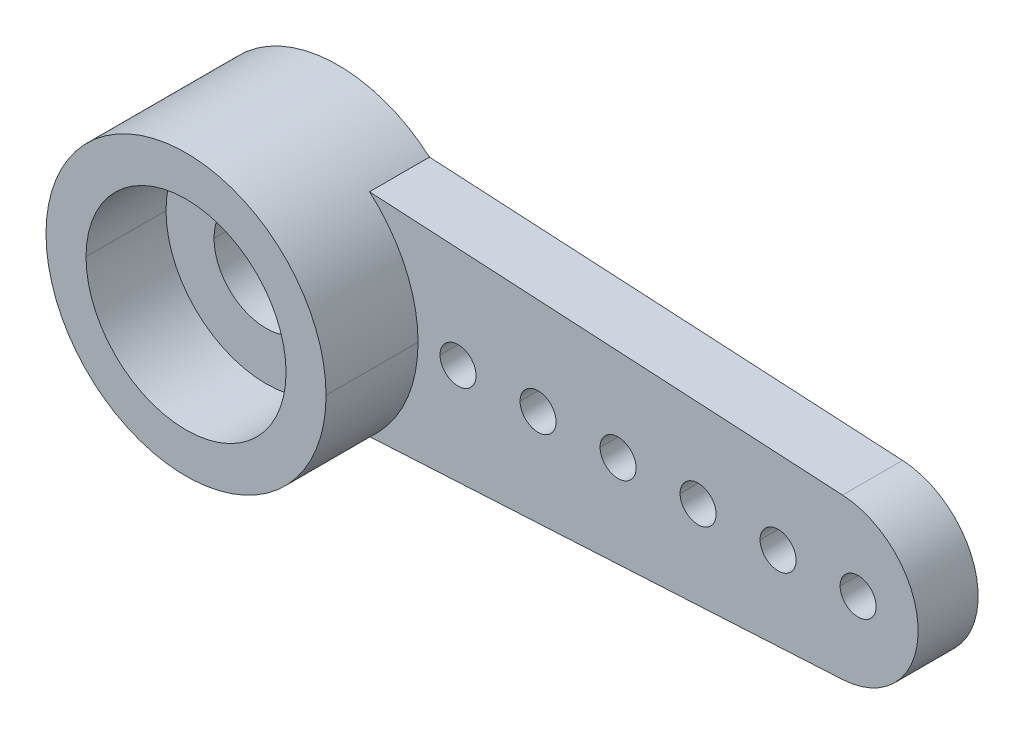
ISO-10303-21;
HEADER;
FILE_DESCRIPTION(('STEP AP214'),'2;1');
FILE_NAME('part.step','',(''),(''),'','','');
FILE_SCHEMA(('AUTOMOTIVE_DESIGN { 1 0 10303 214 1 1 1 1 }'));
ENDSEC;
DATA;
#1=APPLICATION_CONTEXT('core data for automotive mechanical design processes');
#2=APPLICATION_PROTOCOL_DEFINITION('international standard','automotive_design',2000,#1);
#3=PRODUCT_CONTEXT('',#1,'mechanical');
#4=PRODUCT('Part','Part','',(#3));
#5=PRODUCT_RELATED_PRODUCT_CATEGORY('part','',(#4));
#6=PRODUCT_DEFINITION_FORMATION('','',#4);
#7=PRODUCT_DEFINITION_CONTEXT('part definition',#1,'design');
#8=PRODUCT_DEFINITION('design','',#6,#7);
#9=PRODUCT_DEFINITION_SHAPE('','',#8);
#10=(LENGTH_UNIT() NAMED_UNIT(*) SI_UNIT(.MILLI.,.METRE.));
#11=(NAMED_UNIT(*) PLANE_ANGLE_UNIT() SI_UNIT($,.RADIAN.));
#12=(NAMED_UNIT(*) SI_UNIT($,.STERADIAN.) SOLID_ANGLE_UNIT());
#13=UNCERTAINTY_MEASURE_WITH_UNIT(LENGTH_MEASURE(1.E-05),#10,'distance_accuracy_value','');
#14=(GEOMETRIC_REPRESENTATION_CONTEXT(3) GLOBAL_UNCERTAINTY_ASSIGNED_CONTEXT((#13)) GLOBAL_UNIT_ASSIGNED_CONTEXT((#10,
#11,#12)) REPRESENTATION_CONTEXT('',''));
#15=CARTESIAN_POINT('',(0.,0.,0.));
#16=DIRECTION('',(0.,0.,1.));
#17=DIRECTION('',(1.,0.,0.));
#18=AXIS2_PLACEMENT_3D('',#15,#16,#17);
#19=CARTESIAN_POINT('',(8.5,0.,3.801));
#20=DIRECTION('',(0.,0.,-1.));
#21=DIRECTION('',(-1.,0.,0.));
#22=AXIS2_PLACEMENT_3D('',#19,#20,#21);
#23=CYLINDRICAL_SURFACE('',#22,0.45);
#24=DIRECTION('',(0.,0.,-1.));
#25=VECTOR('',#24,1.);
#26=CARTESIAN_POINT('',(8.95,0.,3.801));
#27=LINE('',#26,#25);
#28=CARTESIAN_POINT('',(8.95,0.,1.5));
#29=VERTEX_POINT('',#28);
#30=CARTESIAN_POINT('',(8.95,0.,0.));
#31=VERTEX_POINT('',#30);
#32=EDGE_CURVE('E381',#29,#31,#27,.T.);
#33=ORIENTED_EDGE('',*,*,#32,.F.);
#34=CARTESIAN_POINT('',(8.5,0.,1.5));
#35=DIRECTION('',(0.,0.,-1.));
#36=DIRECTION('',(1.,0.,0.));
#37=AXIS2_PLACEMENT_3D('',#34,#35,#36);
#38=CIRCLE('',#37,0.45);
#39=CARTESIAN_POINT('',(8.05,0.,1.5));
#40=VERTEX_POINT('',#39);
#41=EDGE_CURVE('E255',#40,#29,#38,.T.);
#42=ORIENTED_EDGE('',*,*,#41,.F.);
#43=DIRECTION('',(0.,0.,-1.));
#44=VECTOR('',#43,1.);
#45=CARTESIAN_POINT('',(8.05,0.,3.801));
#46=LINE('',#45,#44);
#47=CARTESIAN_POINT('',(8.05,0.,0.));
#48=VERTEX_POINT('',#47);
#49=EDGE_CURVE('E273',#40,#48,#46,.T.);
#50=ORIENTED_EDGE('',*,*,#49,.T.);
#51=CARTESIAN_POINT('',(8.5,0.,0.));
#52=DIRECTION('',(0.,0.,-1.));
#53=DIRECTION('',(-1.,0.,0.));
#54=AXIS2_PLACEMENT_3D('',#51,#52,#53);
#55=CIRCLE('',#54,0.45);
#56=EDGE_CURVE('E376',#48,#31,#55,.T.);
#57=ORIENTED_EDGE('',*,*,#56,.T.);
#58=EDGE_LOOP('',(#33,#42,#50,#57));
#59=FACE_BOUND('',#58,.T.);
#60=ADVANCED_FACE('F15',(#59),#23,.F.);
#61=CARTESIAN_POINT('',(10.5,0.,3.801));
#62=DIRECTION('',(0.,0.,-1.));
#63=DIRECTION('',(-1.,0.,0.));
#64=AXIS2_PLACEMENT_3D('',#61,#62,#63);
#65=CYLINDRICAL_SURFACE('',#64,0.45);
#66=DIRECTION('',(0.,0.,-1.));
#67=VECTOR('',#66,1.);
#68=CARTESIAN_POINT('',(10.95,0.,3.801));
#69=LINE('',#68,#67);
#70=CARTESIAN_POINT('',(10.95,0.,1.5));
#71=VERTEX_POINT('',#70);
#72=CARTESIAN_POINT('',(10.95,0.,0.));
#73=VERTEX_POINT('',#72);
#74=EDGE_CURVE('E272',#71,#73,#69,.T.);
#75=ORIENTED_EDGE('',*,*,#74,.F.);
#76=CARTESIAN_POINT('',(10.5,0.,1.5));
#77=DIRECTION('',(0.,0.,-1.));
#78=DIRECTION('',(1.,0.,0.));
#79=AXIS2_PLACEMENT_3D('',#76,#77,#78);
#80=CIRCLE('',#79,0.45);
#81=CARTESIAN_POINT('',(10.05,0.,1.5));
#82=VERTEX_POINT('',#81);
#83=EDGE_CURVE('E251',#82,#71,#80,.T.);
#84=ORIENTED_EDGE('',*,*,#83,.F.);
#85=DIRECTION('',(0.,0.,-1.));
#86=VECTOR('',#85,1.);
#87=CARTESIAN_POINT('',(10.05,0.,3.801));
#88=LINE('',#87,#86);
#89=CARTESIAN_POINT('',(10.05,0.,0.));
#90=VERTEX_POINT('',#89);
#91=EDGE_CURVE('E19',#82,#90,#88,.T.);
#92=ORIENTED_EDGE('',*,*,#91,.T.);
#93=CARTESIAN_POINT('',(10.5,0.,0.));
#94=DIRECTION('',(0.,0.,-1.));
#95=DIRECTION('',(-1.,0.,0.));
#96=AXIS2_PLACEMENT_3D('',#93,#94,#95);
#97=CIRCLE('',#96,0.45);
#98=EDGE_CURVE('E397',#90,#73,#97,.T.);
#99=ORIENTED_EDGE('',*,*,#98,.T.);
#100=EDGE_LOOP('',(#75,#84,#92,#99));
#101=FACE_BOUND('',#100,.T.);
#102=ADVANCED_FACE('F717',(#101),#65,.F.);
#103=CARTESIAN_POINT('',(12.5,0.,3.801));
#104=DIRECTION('',(0.,0.,-1.));
#105=DIRECTION('',(-1.,0.,0.));
#106=AXIS2_PLACEMENT_3D('',#103,#104,#105);
#107=CYLINDRICAL_SURFACE('',#106,0.45);
#108=DIRECTION('',(0.,0.,-1.));
#109=VECTOR('',#108,1.);
#110=CARTESIAN_POINT('',(12.95,0.,3.801));
#111=LINE('',#110,#109);
#112=CARTESIAN_POINT('',(12.95,0.,1.5));
#113=VERTEX_POINT('',#112);
#114=CARTESIAN_POINT('',(12.95,0.,0.));
#115=VERTEX_POINT('',#114);
#116=EDGE_CURVE('E249',#113,#115,#111,.T.);
#117=ORIENTED_EDGE('',*,*,#116,.F.);
#118=CARTESIAN_POINT('',(12.5,0.,1.5));
#119=DIRECTION('',(0.,0.,-1.));
#120=DIRECTION('',(1.,0.,0.));
#121=AXIS2_PLACEMENT_3D('',#118,#119,#120);
#122=CIRCLE('',#121,0.45);
#123=CARTESIAN_POINT('',(12.05,0.,1.5));
#124=VERTEX_POINT('',#123);
#125=EDGE_CURVE('E254',#124,#113,#122,.T.);
#126=ORIENTED_EDGE('',*,*,#125,.F.);
#127=DIRECTION('',(0.,0.,-1.));
#128=VECTOR('',#127,1.);
#129=CARTESIAN_POINT('',(12.05,0.,3.801));
#130=LINE('',#129,#128);
#131=CARTESIAN_POINT('',(12.05,0.,0.));
#132=VERTEX_POINT('',#131);
#133=EDGE_CURVE('E283',#124,#132,#130,.T.);
#134=ORIENTED_EDGE('',*,*,#133,.T.);
#135=CARTESIAN_POINT('',(12.5,0.,0.));
#136=DIRECTION('',(0.,0.,-1.));
#137=DIRECTION('',(-1.,0.,0.));
#138=AXIS2_PLACEMENT_3D('',#135,#136,#137);
#139=CIRCLE('',#138,0.45);
#140=EDGE_CURVE('E399',#132,#115,#139,.T.);
#141=ORIENTED_EDGE('',*,*,#140,.T.);
#142=EDGE_LOOP('',(#117,#126,#134,#141));
#143=FACE_BOUND('',#142,.T.);
#144=ADVANCED_FACE('F721',(#143),#107,.F.);
#145=CARTESIAN_POINT('',(14.5,0.,3.801));
#146=DIRECTION('',(0.,0.,-1.));
#147=DIRECTION('',(-1.,0.,0.));
#148=AXIS2_PLACEMENT_3D('',#145,#146,#147);
#149=CYLINDRICAL_SURFACE('',#148,0.45);
#150=DIRECTION('',(0.,0.,-1.));
#151=VECTOR('',#150,1.);
#152=CARTESIAN_POINT('',(14.95,0.,3.801));
#153=LINE('',#152,#151);
#154=CARTESIAN_POINT('',(14.95,0.,1.5));
#155=VERTEX_POINT('',#154);
#156=CARTESIAN_POINT('',(14.95,0.,0.));
#157=VERTEX_POINT('',#156);
#158=EDGE_CURVE('E282',#155,#157,#153,.T.);
#159=ORIENTED_EDGE('',*,*,#158,.F.);
#160=CARTESIAN_POINT('',(14.5,0.,1.5));
#161=DIRECTION('',(0.,0.,-1.));
#162=DIRECTION('',(1.,0.,0.));
#163=AXIS2_PLACEMENT_3D('',#160,#161,#162);
#164=CIRCLE('',#163,0.45);
#165=CARTESIAN_POINT('',(14.05,0.,1.5));
#166=VERTEX_POINT('',#165);
#167=EDGE_CURVE('E309',#166,#155,#164,.T.);
#168=ORIENTED_EDGE('',*,*,#167,.F.);
#169=DIRECTION('',(0.,0.,-1.));
#170=VECTOR('',#169,1.);
#171=CARTESIAN_POINT('',(14.05,0.,3.801));
#172=LINE('',#171,#170);
#173=CARTESIAN_POINT('',(14.05,0.,0.));
#174=VERTEX_POINT('',#173);
#175=EDGE_CURVE('E1038',#166,#174,#172,.T.);
#176=ORIENTED_EDGE('',*,*,#175,.T.);
#177=CARTESIAN_POINT('',(14.5,0.,0.));
#178=DIRECTION('',(0.,0.,-1.));
#179=DIRECTION('',(-1.,0.,0.));
#180=AXIS2_PLACEMENT_3D('',#177,#178,#179);
#181=CIRCLE('',#180,0.45);
#182=EDGE_CURVE('E323',#174,#157,#181,.T.);
#183=ORIENTED_EDGE('',*,*,#182,.T.);
#184=EDGE_LOOP('',(#159,#168,#176,#183));
#185=FACE_BOUND('',#184,.T.);
#186=ADVANCED_FACE('F751',(#185),#149,.F.);
#187=CARTESIAN_POINT('',(6.5,0.,3.801));
#188=DIRECTION('',(0.,0.,-1.));
#189=DIRECTION('',(-1.,0.,0.));
#190=AXIS2_PLACEMENT_3D('',#187,#188,#189);
#191=CYLINDRICAL_SURFACE('',#190,0.45);
#192=DIRECTION('',(0.,0.,-1.));
#193=VECTOR('',#192,1.);
#194=CARTESIAN_POINT('',(6.95,0.,3.801));
#195=LINE('',#194,#193);
#196=CARTESIAN_POINT('',(6.95,0.,1.5));
#197=VERTEX_POINT('',#196);
#198=CARTESIAN_POINT('',(6.95,0.,0.));
#199=VERTEX_POINT('',#198);
#200=EDGE_CURVE('E267',#197,#199,#195,.T.);
#201=ORIENTED_EDGE('',*,*,#200,.F.);
#202=CARTESIAN_POINT('',(6.5,0.,1.5));
#203=DIRECTION('',(0.,0.,-1.));
#204=DIRECTION('',(1.,0.,0.));
#205=AXIS2_PLACEMENT_3D('',#202,#203,#204);
#206=CIRCLE('',#205,0.45);
#207=CARTESIAN_POINT('',(6.05,0.,1.5));
#208=VERTEX_POINT('',#207);
#209=EDGE_CURVE('E312',#208,#197,#206,.T.);
#210=ORIENTED_EDGE('',*,*,#209,.F.);
#211=DIRECTION('',(0.,0.,-1.));
#212=VECTOR('',#211,1.);
#213=CARTESIAN_POINT('',(6.05,0.,3.801));
#214=LINE('',#213,#212);
#215=CARTESIAN_POINT('',(6.05,0.,0.));
#216=VERTEX_POINT('',#215);
#217=EDGE_CURVE('E266',#208,#216,#214,.T.);
#218=ORIENTED_EDGE('',*,*,#217,.T.);
#219=CARTESIAN_POINT('',(6.5,0.,0.));
#220=DIRECTION('',(0.,0.,-1.));
#221=DIRECTION('',(-1.,0.,0.));
#222=AXIS2_PLACEMENT_3D('',#219,#220,#221);
#223=CIRCLE('',#222,0.45);
#224=EDGE_CURVE('E320',#216,#199,#223,.T.);
#225=ORIENTED_EDGE('',*,*,#224,.T.);
#226=EDGE_LOOP('',(#201,#210,#218,#225));
#227=FACE_BOUND('',#226,.T.);
#228=ADVANCED_FACE('F755',(#227),#191,.F.);
#229=CARTESIAN_POINT('',(4.5,0.,3.801));
#230=DIRECTION('',(0.,0.,-1.));
#231=DIRECTION('',(-1.,0.,0.));
#232=AXIS2_PLACEMENT_3D('',#229,#230,#231);
#233=CYLINDRICAL_SURFACE('',#232,0.45);
#234=DIRECTION('',(0.,0.,-1.));
#235=VECTOR('',#234,1.);
#236=CARTESIAN_POINT('',(4.95,0.,3.801));
#237=LINE('',#236,#235);
#238=CARTESIAN_POINT('',(4.95,0.,1.5));
#239=VERTEX_POINT('',#238);
#240=CARTESIAN_POINT('',(4.95,0.,0.));
#241=VERTEX_POINT('',#240);
#242=EDGE_CURVE('E327',#239,#241,#237,.T.);
#243=ORIENTED_EDGE('',*,*,#242,.F.);
#244=CARTESIAN_POINT('',(4.5,0.,1.5));
#245=DIRECTION('',(0.,0.,-1.));
#246=DIRECTION('',(1.,0.,0.));
#247=AXIS2_PLACEMENT_3D('',#244,#245,#246);
#248=CIRCLE('',#247,0.45);
#249=CARTESIAN_POINT('',(4.05,0.,1.5));
#250=VERTEX_POINT('',#249);
#251=EDGE_CURVE('E341',#250,#239,#248,.T.);
#252=ORIENTED_EDGE('',*,*,#251,.F.);
#253=DIRECTION('',(0.,0.,-1.));
#254=VECTOR('',#253,1.);
#255=CARTESIAN_POINT('',(4.05,0.,3.801));
#256=LINE('',#255,#254);
#257=CARTESIAN_POINT('',(4.05,0.,0.));
#258=VERTEX_POINT('',#257);
#259=EDGE_CURVE('E336',#250,#258,#256,.T.);
#260=ORIENTED_EDGE('',*,*,#259,.T.);
#261=CARTESIAN_POINT('',(4.5,0.,0.));
#262=DIRECTION('',(0.,0.,-1.));
#263=DIRECTION('',(-1.,0.,0.));
#264=AXIS2_PLACEMENT_3D('',#261,#262,#263);
#265=CIRCLE('',#264,0.45);
#266=EDGE_CURVE('E226',#258,#241,#265,.T.);
#267=ORIENTED_EDGE('',*,*,#266,.T.);
#268=EDGE_LOOP('',(#243,#252,#260,#267));
#269=FACE_BOUND('',#268,.T.);
#270=ADVANCED_FACE('F435',(#269),#233,.F.);
#271=CARTESIAN_POINT('',(0.,0.,1.1));
#272=DIRECTION('',(0.,0.,-1.));
#273=DIRECTION('',(0.,-1.,0.));
#274=AXIS2_PLACEMENT_3D('',#271,#272,#273);
#275=PLANE('',#274);
#276=CARTESIAN_POINT('',(0.,0.,1.1));
#277=DIRECTION('',(0.,0.,-1.));
#278=DIRECTION('',(-1.,0.,0.));
#279=AXIS2_PLACEMENT_3D('',#276,#277,#278);
#280=CIRCLE('',#279,1.3);
#281=CARTESIAN_POINT('',(-1.3,0.,1.1));
#282=VERTEX_POINT('',#281);
#283=CARTESIAN_POINT('',(1.3,0.,1.1));
#284=VERTEX_POINT('',#283);
#285=EDGE_CURVE('E392',#282,#284,#280,.T.);
#286=ORIENTED_EDGE('',*,*,#285,.F.);
#287=CARTESIAN_POINT('',(0.,0.,1.1));
#288=DIRECTION('',(0.,0.,-1.));
#289=DIRECTION('',(-1.,0.,0.));
#290=AXIS2_PLACEMENT_3D('',#287,#288,#289);
#291=CIRCLE('',#290,1.3);
#292=EDGE_CURVE('E1031',#284,#282,#291,.T.);
#293=ORIENTED_EDGE('',*,*,#292,.F.);
#294=EDGE_LOOP('',(#286,#293));
#295=FACE_BOUND('',#294,.T.);
#296=CARTESIAN_POINT('',(0.,0.,1.1));
#297=DIRECTION('',(0.,0.,-1.));
#298=DIRECTION('',(-1.,0.,0.));
#299=AXIS2_PLACEMENT_3D('',#296,#297,#298);
#300=CIRCLE('',#299,2.35);
#301=CARTESIAN_POINT('',(-2.35,0.,1.1));
#302=VERTEX_POINT('',#301);
#303=CARTESIAN_POINT('',(2.35,0.,1.1));
#304=VERTEX_POINT('',#303);
#305=EDGE_CURVE('E10',#302,#304,#300,.T.);
#306=ORIENTED_EDGE('',*,*,#305,.T.);
#307=CARTESIAN_POINT('',(0.,0.,1.1));
#308=DIRECTION('',(0.,0.,-1.));
#309=DIRECTION('',(-1.,0.,0.));
#310=AXIS2_PLACEMENT_3D('',#307,#308,#309);
#311=CIRCLE('',#310,2.35);
#312=EDGE_CURVE('E245',#304,#302,#311,.T.);
#313=ORIENTED_EDGE('',*,*,#312,.T.);
#314=EDGE_LOOP('',(#306,#313));
#315=FACE_BOUND('',#314,.T.);
#316=ADVANCED_FACE('F643',(#295,#315),#275,.T.);
#317=CARTESIAN_POINT('',(0.,0.,1.1));
#318=DIRECTION('',(0.,0.,-1.));
#319=DIRECTION('',(-1.,0.,0.));
#320=AXIS2_PLACEMENT_3D('',#317,#318,#319);
#321=CYLINDRICAL_SURFACE('',#320,2.35);
#322=DIRECTION('',(0.,0.,-1.));
#323=VECTOR('',#322,1.);
#324=CARTESIAN_POINT('',(2.35,0.,1.1));
#325=LINE('',#324,#323);
#326=CARTESIAN_POINT('',(2.35,0.,0.));
#327=VERTEX_POINT('',#326);
#328=EDGE_CURVE('E237',#304,#327,#325,.T.);
#329=ORIENTED_EDGE('',*,*,#328,.F.);
#330=ORIENTED_EDGE('',*,*,#305,.F.);
#331=DIRECTION('',(0.,0.,-1.));
#332=VECTOR('',#331,1.);
#333=CARTESIAN_POINT('',(-2.35,0.,1.1));
#334=LINE('',#333,#332);
#335=CARTESIAN_POINT('',(-2.35,0.,0.));
#336=VERTEX_POINT('',#335);
#337=EDGE_CURVE('E228',#302,#336,#334,.T.);
#338=ORIENTED_EDGE('',*,*,#337,.T.);
#339=CARTESIAN_POINT('',(0.,0.,0.));
#340=DIRECTION('',(0.,0.,-1.));
#341=DIRECTION('',(-1.,0.,0.));
#342=AXIS2_PLACEMENT_3D('',#339,#340,#341);
#343=CIRCLE('',#342,2.35);
#344=EDGE_CURVE('E215',#336,#327,#343,.T.);
#345=ORIENTED_EDGE('',*,*,#344,.T.);
#346=EDGE_LOOP('',(#329,#330,#338,#345));
#347=FACE_BOUND('',#346,.T.);
#348=ADVANCED_FACE('F229',(#347),#321,.F.);
#349=CARTESIAN_POINT('',(0.,0.,3.8));
#350=DIRECTION('',(0.,0.,-1.));
#351=DIRECTION('',(-1.,0.,0.));
#352=AXIS2_PLACEMENT_3D('',#349,#350,#351);
#353=CYLINDRICAL_SURFACE('',#352,2.5);
#354=DIRECTION('',(0.,0.,-1.));
#355=VECTOR('',#354,1.);
#356=CARTESIAN_POINT('',(2.5,0.,3.8));
#357=LINE('',#356,#355);
#358=CARTESIAN_POINT('',(2.5,0.,3.8));
#359=VERTEX_POINT('',#358);
#360=CARTESIAN_POINT('',(2.5,0.,1.8));
#361=VERTEX_POINT('',#360);
#362=EDGE_CURVE('E305',#359,#361,#357,.T.);
#363=ORIENTED_EDGE('',*,*,#362,.F.);
#364=CARTESIAN_POINT('',(0.,0.,3.8));
#365=DIRECTION('',(0.,0.,1.));
#366=DIRECTION('',(1.,0.,0.));
#367=AXIS2_PLACEMENT_3D('',#364,#365,#366);
#368=CIRCLE('',#367,2.5);
#369=CARTESIAN_POINT('',(-2.5,0.,3.8));
#370=VERTEX_POINT('',#369);
#371=EDGE_CURVE('E26',#359,#370,#368,.T.);
#372=ORIENTED_EDGE('',*,*,#371,.T.);
#373=DIRECTION('',(0.,0.,-1.));
#374=VECTOR('',#373,1.);
#375=CARTESIAN_POINT('',(-2.5,0.,3.8));
#376=LINE('',#375,#374);
#377=CARTESIAN_POINT('',(-2.5,0.,1.8));
#378=VERTEX_POINT('',#377);
#379=EDGE_CURVE('E304',#370,#378,#376,.T.);
#380=ORIENTED_EDGE('',*,*,#379,.T.);
#381=CARTESIAN_POINT('',(0.,0.,1.8));
#382=DIRECTION('',(0.,0.,1.));
#383=DIRECTION('',(1.,0.,0.));
#384=AXIS2_PLACEMENT_3D('',#381,#382,#383);
#385=CIRCLE('',#384,2.5);
#386=EDGE_CURVE('E395',#361,#378,#385,.T.);
#387=ORIENTED_EDGE('',*,*,#386,.F.);
#388=EDGE_LOOP('',(#363,#372,#380,#387));
#389=FACE_BOUND('',#388,.T.);
#390=ADVANCED_FACE('F473',(#389),#353,.F.);
#391=CARTESIAN_POINT('',(0.,0.,3.8));
#392=DIRECTION('',(0.,0.,1.));
#393=DIRECTION('',(1.,0.,0.));
#394=AXIS2_PLACEMENT_3D('',#391,#392,#393);
#395=PLANE('',#394);
#396=CARTESIAN_POINT('',(0.,0.,3.8));
#397=DIRECTION('',(0.,0.,1.));
#398=DIRECTION('',(1.,0.,0.));
#399=AXIS2_PLACEMENT_3D('',#396,#397,#398);
#400=CIRCLE('',#399,2.5);
#401=EDGE_CURVE('E234',#370,#359,#400,.T.);
#402=ORIENTED_EDGE('',*,*,#401,.F.);
#403=ORIENTED_EDGE('',*,*,#371,.F.);
#404=EDGE_LOOP('',(#402,#403));
#405=FACE_BOUND('',#404,.T.);
#406=CARTESIAN_POINT('',(0.,0.,3.8));
#407=DIRECTION('',(0.,0.,1.));
#408=DIRECTION('',(1.,0.,0.));
#409=AXIS2_PLACEMENT_3D('',#406,#407,#408);
#410=CIRCLE('',#409,3.5);
#411=CARTESIAN_POINT('',(-3.5,0.,3.8));
#412=VERTEX_POINT('',#411);
#413=CARTESIAN_POINT('',(3.5,0.,3.8));
#414=VERTEX_POINT('',#413);
#415=EDGE_CURVE('E225',#412,#414,#410,.T.);
#416=ORIENTED_EDGE('',*,*,#415,.T.);
#417=CARTESIAN_POINT('',(0.,0.,3.8));
#418=DIRECTION('',(0.,0.,1.));
#419=DIRECTION('',(1.,0.,0.));
#420=AXIS2_PLACEMENT_3D('',#417,#418,#419);
#421=CIRCLE('',#420,3.5);
#422=EDGE_CURVE('E348',#414,#412,#421,.T.);
#423=ORIENTED_EDGE('',*,*,#422,.T.);
#424=EDGE_LOOP('',(#416,#423));
#425=FACE_BOUND('',#424,.T.);
#426=ADVANCED_FACE('F704',(#405,#425),#395,.T.);
#427=CARTESIAN_POINT('',(2.28637267303473,2.65,1.5));
#428=DIRECTION('',(-0.055146658226505,-0.998478265204831,0.));
#429=DIRECTION('',(-0.998478265204831,0.055146658226505,0.));
#430=AXIS2_PLACEMENT_3D('',#427,#428,#429);
#431=PLANE('',#430);
#432=DIRECTION('',(-0.998478265204831,0.055146658226505,0.));
#433=VECTOR('',#432,1.);
#434=CARTESIAN_POINT('',(2.28637267303473,2.65,0.));
#435=LINE('',#434,#433);
#436=CARTESIAN_POINT('',(14.110293316453,1.99695653040966,0.));
#437=VERTEX_POINT('',#436);
#438=CARTESIAN_POINT('',(2.28637267303473,2.65,0.));
#439=VERTEX_POINT('',#438);
#440=EDGE_CURVE('E344',#437,#439,#435,.T.);
#441=ORIENTED_EDGE('',*,*,#440,.T.);
#442=DIRECTION('',(0.,0.,-1.));
#443=VECTOR('',#442,1.);
#444=CARTESIAN_POINT('',(2.28637267303473,2.65,1.5));
#445=LINE('',#444,#443);
#446=CARTESIAN_POINT('',(2.28637267303473,2.65,1.5));
#447=VERTEX_POINT('',#446);
#448=EDGE_CURVE('E288',#447,#439,#445,.T.);
#449=ORIENTED_EDGE('',*,*,#448,.F.);
#450=DIRECTION('',(-0.998478265204831,0.055146658226505,0.));
#451=VECTOR('',#450,1.);
#452=CARTESIAN_POINT('',(2.28637267303473,2.65,1.5));
#453=LINE('',#452,#451);
#454=CARTESIAN_POINT('',(14.110293316453,1.99695653040966,1.5));
#455=VERTEX_POINT('',#454);
#456=EDGE_CURVE('E298',#455,#447,#453,.T.);
#457=ORIENTED_EDGE('',*,*,#456,.F.);
#458=DIRECTION('',(0.,0.,-1.));
#459=VECTOR('',#458,1.);
#460=CARTESIAN_POINT('',(14.110293316453,1.99695653040966,1.5));
#461=LINE('',#460,#459);
#462=EDGE_CURVE('E340',#455,#437,#461,.T.);
#463=ORIENTED_EDGE('',*,*,#462,.T.);
#464=EDGE_LOOP('',(#441,#449,#457,#463));
#465=FACE_BOUND('',#464,.T.);
#466=ADVANCED_FACE('F670',(#465),#431,.F.);
#467=CARTESIAN_POINT('',(14.,0.,1.5));
#468=DIRECTION('',(0.,0.,-1.));
#469=DIRECTION('',(-1.,0.,0.));
#470=AXIS2_PLACEMENT_3D('',#467,#468,#469);
#471=CYLINDRICAL_SURFACE('',#470,2.);
#472=CARTESIAN_POINT('',(14.,0.,0.));
#473=DIRECTION('',(0.,0.,1.));
#474=DIRECTION('',(-1.,0.,0.));
#475=AXIS2_PLACEMENT_3D('',#472,#473,#474);
#476=CIRCLE('',#475,2.);
#477=CARTESIAN_POINT('',(14.110293316453,-1.99695653040966,0.));
#478=VERTEX_POINT('',#477);
#479=EDGE_CURVE('E368',#478,#437,#476,.T.);
#480=ORIENTED_EDGE('',*,*,#479,.T.);
#481=ORIENTED_EDGE('',*,*,#462,.F.);
#482=CARTESIAN_POINT('',(14.,0.,1.5));
#483=DIRECTION('',(0.,0.,1.));
#484=DIRECTION('',(-1.,0.,0.));
#485=AXIS2_PLACEMENT_3D('',#482,#483,#484);
#486=CIRCLE('',#485,2.);
#487=CARTESIAN_POINT('',(14.110293316453,-1.99695653040966,1.5));
#488=VERTEX_POINT('',#487);
#489=EDGE_CURVE('E294',#488,#455,#486,.T.);
#490=ORIENTED_EDGE('',*,*,#489,.F.);
#491=DIRECTION('',(0.,0.,-1.));
#492=VECTOR('',#491,1.);
#493=CARTESIAN_POINT('',(14.110293316453,-1.99695653040966,1.5));
#494=LINE('',#493,#492);
#495=EDGE_CURVE('E337',#488,#478,#494,.T.);
#496=ORIENTED_EDGE('',*,*,#495,.T.);
#497=EDGE_LOOP('',(#480,#481,#490,#496));
#498=FACE_BOUND('',#497,.T.);
#499=ADVANCED_FACE('F665',(#498),#471,.T.);
#500=CARTESIAN_POINT('',(14.110293316453,-1.99695653040966,1.5));
#501=DIRECTION('',(-0.0551466582265052,0.998478265204831,0.));
#502=DIRECTION('',(0.,0.,1.));
#503=AXIS2_PLACEMENT_3D('',#500,#501,#502);
#504=PLANE('',#503);
#505=DIRECTION('',(0.998478265204831,0.0551466582265051,0.));
#506=VECTOR('',#505,1.);
#507=CARTESIAN_POINT('',(14.110293316453,-1.99695653040966,0.));
#508=LINE('',#507,#506);
#509=CARTESIAN_POINT('',(2.28637267303473,-2.65,0.));
#510=VERTEX_POINT('',#509);
#511=EDGE_CURVE('E372',#510,#478,#508,.T.);
#512=ORIENTED_EDGE('',*,*,#511,.T.);
#513=ORIENTED_EDGE('',*,*,#495,.F.);
#514=DIRECTION('',(0.998478265204831,0.0551466582265051,0.));
#515=VECTOR('',#514,1.);
#516=CARTESIAN_POINT('',(14.110293316453,-1.99695653040966,1.5));
#517=LINE('',#516,#515);
#518=CARTESIAN_POINT('',(2.28637267303473,-2.65,1.5));
#519=VERTEX_POINT('',#518);
#520=EDGE_CURVE('E299',#519,#488,#517,.T.);
#521=ORIENTED_EDGE('',*,*,#520,.F.);
#522=DIRECTION('',(0.,0.,-1.));
#523=VECTOR('',#522,1.);
#524=CARTESIAN_POINT('',(2.28637267303473,-2.65,1.5));
#525=LINE('',#524,#523);
#526=EDGE_CURVE('E41',#519,#510,#525,.T.);
#527=ORIENTED_EDGE('',*,*,#526,.T.);
#528=EDGE_LOOP('',(#512,#513,#521,#527));
#529=FACE_BOUND('',#528,.T.);
#530=ADVANCED_FACE('F669',(#529),#504,.F.);
#531=CARTESIAN_POINT('',(0.,0.,1.5));
#532=DIRECTION('',(0.,0.,-1.));
#533=DIRECTION('',(-1.,0.,0.));
#534=AXIS2_PLACEMENT_3D('',#531,#532,#533);
#535=CYLINDRICAL_SURFACE('',#534,3.5);
#536=DIRECTION('',(0.,0.,-1.));
#537=VECTOR('',#536,1.);
#538=CARTESIAN_POINT('',(3.5,0.,1.5));
#539=LINE('',#538,#537);
#540=CARTESIAN_POINT('',(3.5,0.,1.5));
#541=VERTEX_POINT('',#540);
#542=EDGE_CURVE('E289',#414,#541,#539,.T.);
#543=ORIENTED_EDGE('',*,*,#542,.F.);
#544=ORIENTED_EDGE('',*,*,#415,.F.);
#545=DIRECTION('',(0.,0.,-1.));
#546=VECTOR('',#545,1.);
#547=CARTESIAN_POINT('',(-3.5,0.,1.5));
#548=LINE('',#547,#546);
#549=CARTESIAN_POINT('',(-3.5,0.,0.));
#550=VERTEX_POINT('',#549);
#551=EDGE_CURVE('E261',#412,#550,#548,.T.);
#552=ORIENTED_EDGE('',*,*,#551,.T.);
#553=CARTESIAN_POINT('',(0.,0.,0.));
#554=DIRECTION('',(0.,0.,1.));
#555=DIRECTION('',(1.,0.,0.));
#556=AXIS2_PLACEMENT_3D('',#553,#554,#555);
#557=CIRCLE('',#556,3.5);
#558=EDGE_CURVE('E373',#550,#510,#557,.T.);
#559=ORIENTED_EDGE('',*,*,#558,.T.);
#560=ORIENTED_EDGE('',*,*,#526,.F.);
#561=CARTESIAN_POINT('',(0.,0.,1.5));
#562=DIRECTION('',(0.,0.,1.));
#563=DIRECTION('',(1.,0.,0.));
#564=AXIS2_PLACEMENT_3D('',#561,#562,#563);
#565=CIRCLE('',#564,3.5);
#566=EDGE_CURVE('E409',#519,#541,#565,.T.);
#567=ORIENTED_EDGE('',*,*,#566,.T.);
#568=EDGE_LOOP('',(#543,#544,#552,#559,#560,#567));
#569=FACE_BOUND('',#568,.T.);
#570=ADVANCED_FACE('F619',(#569),#535,.T.);
#571=CARTESIAN_POINT('',(0.,0.,0.));
#572=DIRECTION('',(0.,0.,1.));
#573=DIRECTION('',(1.,0.,0.));
#574=AXIS2_PLACEMENT_3D('',#571,#572,#573);
#575=PLANE('',#574);
#576=ORIENTED_EDGE('',*,*,#344,.F.);
#577=CARTESIAN_POINT('',(0.,0.,0.));
#578=DIRECTION('',(0.,0.,-1.));
#579=DIRECTION('',(-1.,0.,0.));
#580=AXIS2_PLACEMENT_3D('',#577,#578,#579);
#581=CIRCLE('',#580,2.35);
#582=EDGE_CURVE('E220',#327,#336,#581,.T.);
#583=ORIENTED_EDGE('',*,*,#582,.F.);
#584=EDGE_LOOP('',(#576,#583));
#585=FACE_BOUND('',#584,.T.);
#586=ORIENTED_EDGE('',*,*,#266,.F.);
#587=CARTESIAN_POINT('',(4.5,0.,0.));
#588=DIRECTION('',(0.,0.,-1.));
#589=DIRECTION('',(-1.,0.,0.));
#590=AXIS2_PLACEMENT_3D('',#587,#588,#589);
#591=CIRCLE('',#590,0.45);
#592=EDGE_CURVE('E331',#241,#258,#591,.T.);
#593=ORIENTED_EDGE('',*,*,#592,.F.);
#594=EDGE_LOOP('',(#586,#593));
#595=FACE_BOUND('',#594,.T.);
#596=ORIENTED_EDGE('',*,*,#224,.F.);
#597=CARTESIAN_POINT('',(6.5,0.,0.));
#598=DIRECTION('',(0.,0.,-1.));
#599=DIRECTION('',(-1.,0.,0.));
#600=AXIS2_PLACEMENT_3D('',#597,#598,#599);
#601=CIRCLE('',#600,0.45);
#602=EDGE_CURVE('E262',#199,#216,#601,.T.);
#603=ORIENTED_EDGE('',*,*,#602,.F.);
#604=EDGE_LOOP('',(#596,#603));
#605=FACE_BOUND('',#604,.T.);
#606=ORIENTED_EDGE('',*,*,#182,.F.);
#607=CARTESIAN_POINT('',(14.5,0.,0.));
#608=DIRECTION('',(0.,0.,-1.));
#609=DIRECTION('',(-1.,0.,0.));
#610=AXIS2_PLACEMENT_3D('',#607,#608,#609);
#611=CIRCLE('',#610,0.45);
#612=EDGE_CURVE('E385',#157,#174,#611,.T.);
#613=ORIENTED_EDGE('',*,*,#612,.F.);
#614=EDGE_LOOP('',(#606,#613));
#615=FACE_BOUND('',#614,.T.);
#616=ORIENTED_EDGE('',*,*,#140,.F.);
#617=CARTESIAN_POINT('',(12.5,0.,0.));
#618=DIRECTION('',(0.,0.,-1.));
#619=DIRECTION('',(-1.,0.,0.));
#620=AXIS2_PLACEMENT_3D('',#617,#618,#619);
#621=CIRCLE('',#620,0.45);
#622=EDGE_CURVE('E293',#115,#132,#621,.T.);
#623=ORIENTED_EDGE('',*,*,#622,.F.);
#624=EDGE_LOOP('',(#616,#623));
#625=FACE_BOUND('',#624,.T.);
#626=ORIENTED_EDGE('',*,*,#98,.F.);
#627=CARTESIAN_POINT('',(10.5,0.,0.));
#628=DIRECTION('',(0.,0.,-1.));
#629=DIRECTION('',(-1.,0.,0.));
#630=AXIS2_PLACEMENT_3D('',#627,#628,#629);
#631=CIRCLE('',#630,0.45);
#632=EDGE_CURVE('E613',#73,#90,#631,.T.);
#633=ORIENTED_EDGE('',*,*,#632,.F.);
#634=EDGE_LOOP('',(#626,#633));
#635=FACE_BOUND('',#634,.T.);
#636=ORIENTED_EDGE('',*,*,#56,.F.);
#637=CARTESIAN_POINT('',(8.5,0.,0.));
#638=DIRECTION('',(0.,0.,-1.));
#639=DIRECTION('',(-1.,0.,0.));
#640=AXIS2_PLACEMENT_3D('',#637,#638,#639);
#641=CIRCLE('',#640,0.45);
#642=EDGE_CURVE('E377',#31,#48,#641,.T.);
#643=ORIENTED_EDGE('',*,*,#642,.F.);
#644=EDGE_LOOP('',(#636,#643));
#645=FACE_BOUND('',#644,.T.);
#646=CARTESIAN_POINT('',(0.,0.,0.));
#647=DIRECTION('',(0.,0.,1.));
#648=DIRECTION('',(1.,0.,0.));
#649=AXIS2_PLACEMENT_3D('',#646,#647,#648);
#650=CIRCLE('',#649,3.5);
#651=EDGE_CURVE('E277',#439,#550,#650,.T.);
#652=ORIENTED_EDGE('',*,*,#651,.F.);
#653=ORIENTED_EDGE('',*,*,#440,.F.);
#654=ORIENTED_EDGE('',*,*,#479,.F.);
#655=ORIENTED_EDGE('',*,*,#511,.F.);
#656=ORIENTED_EDGE('',*,*,#558,.F.);
#657=EDGE_LOOP('',(#652,#653,#654,#655,#656));
#658=FACE_BOUND('',#657,.T.);
#659=ADVANCED_FACE('F217',(#585,#595,#605,#615,#625,#635,#645,#658),#575,.F.);
#660=CARTESIAN_POINT('',(0.,0.,1.5));
#661=DIRECTION('',(0.,0.,1.));
#662=DIRECTION('',(1.,0.,0.));
#663=AXIS2_PLACEMENT_3D('',#660,#661,#662);
#664=PLANE('',#663);
#665=ORIENTED_EDGE('',*,*,#251,.T.);
#666=CARTESIAN_POINT('',(4.5,0.,1.5));
#667=DIRECTION('',(0.,0.,-1.));
#668=DIRECTION('',(1.,0.,0.));
#669=AXIS2_PLACEMENT_3D('',#666,#667,#668);
#670=CIRCLE('',#669,0.45);
#671=EDGE_CURVE('E332',#239,#250,#670,.T.);
#672=ORIENTED_EDGE('',*,*,#671,.T.);
#673=EDGE_LOOP('',(#665,#672));
#674=FACE_BOUND('',#673,.T.);
#675=ORIENTED_EDGE('',*,*,#209,.T.);
#676=CARTESIAN_POINT('',(6.5,0.,1.5));
#677=DIRECTION('',(0.,0.,-1.));
#678=DIRECTION('',(1.,0.,0.));
#679=AXIS2_PLACEMENT_3D('',#676,#677,#678);
#680=CIRCLE('',#679,0.45);
#681=EDGE_CURVE('E1041',#197,#208,#680,.T.);
#682=ORIENTED_EDGE('',*,*,#681,.T.);
#683=EDGE_LOOP('',(#675,#682));
#684=FACE_BOUND('',#683,.T.);
#685=ORIENTED_EDGE('',*,*,#167,.T.);
#686=CARTESIAN_POINT('',(14.5,0.,1.5));
#687=DIRECTION('',(0.,0.,-1.));
#688=DIRECTION('',(1.,0.,0.));
#689=AXIS2_PLACEMENT_3D('',#686,#687,#688);
#690=CIRCLE('',#689,0.45);
#691=EDGE_CURVE('E278',#155,#166,#690,.T.);
#692=ORIENTED_EDGE('',*,*,#691,.T.);
#693=EDGE_LOOP('',(#685,#692));
#694=FACE_BOUND('',#693,.T.);
#695=ORIENTED_EDGE('',*,*,#125,.T.);
#696=CARTESIAN_POINT('',(12.5,0.,1.5));
#697=DIRECTION('',(0.,0.,-1.));
#698=DIRECTION('',(1.,0.,0.));
#699=AXIS2_PLACEMENT_3D('',#696,#697,#698);
#700=CIRCLE('',#699,0.45);
#701=EDGE_CURVE('E313',#113,#124,#700,.T.);
#702=ORIENTED_EDGE('',*,*,#701,.T.);
#703=EDGE_LOOP('',(#695,#702));
#704=FACE_BOUND('',#703,.T.);
#705=ORIENTED_EDGE('',*,*,#83,.T.);
#706=CARTESIAN_POINT('',(10.5,0.,1.5));
#707=DIRECTION('',(0.,0.,-1.));
#708=DIRECTION('',(1.,0.,0.));
#709=AXIS2_PLACEMENT_3D('',#706,#707,#708);
#710=CIRCLE('',#709,0.45);
#711=EDGE_CURVE('E268',#71,#82,#710,.T.);
#712=ORIENTED_EDGE('',*,*,#711,.T.);
#713=EDGE_LOOP('',(#705,#712));
#714=FACE_BOUND('',#713,.T.);
#715=ORIENTED_EDGE('',*,*,#41,.T.);
#716=CARTESIAN_POINT('',(8.5,0.,1.5));
#717=DIRECTION('',(0.,0.,-1.));
#718=DIRECTION('',(1.,0.,0.));
#719=AXIS2_PLACEMENT_3D('',#716,#717,#718);
#720=CIRCLE('',#719,0.45);
#721=EDGE_CURVE('E1029',#29,#40,#720,.T.);
#722=ORIENTED_EDGE('',*,*,#721,.T.);
#723=EDGE_LOOP('',(#715,#722));
#724=FACE_BOUND('',#723,.T.);
#725=ORIENTED_EDGE('',*,*,#566,.F.);
#726=ORIENTED_EDGE('',*,*,#520,.T.);
#727=ORIENTED_EDGE('',*,*,#489,.T.);
#728=ORIENTED_EDGE('',*,*,#456,.T.);
#729=CARTESIAN_POINT('',(0.,0.,1.5));
#730=DIRECTION('',(0.,0.,1.));
#731=DIRECTION('',(1.,0.,0.));
#732=AXIS2_PLACEMENT_3D('',#729,#730,#731);
#733=CIRCLE('',#732,3.5);
#734=EDGE_CURVE('E284',#541,#447,#733,.T.);
#735=ORIENTED_EDGE('',*,*,#734,.F.);
#736=EDGE_LOOP('',(#725,#726,#727,#728,#735));
#737=FACE_BOUND('',#736,.T.);
#738=ADVANCED_FACE('F442',(#674,#684,#694,#704,#714,#724,#737),#664,.T.);
#739=CARTESIAN_POINT('',(0.,0.,1.8));
#740=DIRECTION('',(0.,0.,1.));
#741=DIRECTION('',(1.,0.,0.));
#742=AXIS2_PLACEMENT_3D('',#739,#740,#741);
#743=PLANE('',#742);
#744=CARTESIAN_POINT('',(0.,0.,1.8));
#745=DIRECTION('',(0.,0.,1.));
#746=DIRECTION('',(1.,0.,0.));
#747=AXIS2_PLACEMENT_3D('',#744,#745,#746);
#748=CIRCLE('',#747,1.3);
#749=CARTESIAN_POINT('',(-1.3,0.,1.8));
#750=VERTEX_POINT('',#749);
#751=CARTESIAN_POINT('',(1.3,0.,1.8));
#752=VERTEX_POINT('',#751);
#753=EDGE_CURVE('E256',#750,#752,#748,.T.);
#754=ORIENTED_EDGE('',*,*,#753,.F.);
#755=CARTESIAN_POINT('',(0.,0.,1.8));
#756=DIRECTION('',(0.,0.,1.));
#757=DIRECTION('',(1.,0.,0.));
#758=AXIS2_PLACEMENT_3D('',#755,#756,#757);
#759=CIRCLE('',#758,1.3);
#760=EDGE_CURVE('E396',#752,#750,#759,.T.);
#761=ORIENTED_EDGE('',*,*,#760,.F.);
#762=EDGE_LOOP('',(#754,#761));
#763=FACE_BOUND('',#762,.T.);
#764=CARTESIAN_POINT('',(0.,0.,1.8));
#765=DIRECTION('',(0.,0.,1.));
#766=DIRECTION('',(1.,0.,0.));
#767=AXIS2_PLACEMENT_3D('',#764,#765,#766);
#768=CIRCLE('',#767,2.5);
#769=EDGE_CURVE('E300',#378,#361,#768,.T.);
#770=ORIENTED_EDGE('',*,*,#769,.T.);
#771=ORIENTED_EDGE('',*,*,#386,.T.);
#772=EDGE_LOOP('',(#770,#771));
#773=FACE_BOUND('',#772,.T.);
#774=ADVANCED_FACE('F445',(#763,#773),#743,.T.);
#775=CARTESIAN_POINT('',(0.,0.,1.5));
#776=DIRECTION('',(0.,0.,-1.));
#777=DIRECTION('',(-1.,0.,0.));
#778=AXIS2_PLACEMENT_3D('',#775,#776,#777);
#779=CYLINDRICAL_SURFACE('',#778,1.3);
#780=DIRECTION('',(0.,0.,-1.));
#781=VECTOR('',#780,1.);
#782=CARTESIAN_POINT('',(1.3,0.,1.5));
#783=LINE('',#782,#781);
#784=EDGE_CURVE('E260',#752,#284,#783,.T.);
#785=ORIENTED_EDGE('',*,*,#784,.F.);
#786=ORIENTED_EDGE('',*,*,#760,.T.);
#787=DIRECTION('',(0.,0.,-1.));
#788=VECTOR('',#787,1.);
#789=CARTESIAN_POINT('',(-1.3,0.,1.5));
#790=LINE('',#789,#788);
#791=EDGE_CURVE('E426',#750,#282,#790,.T.);
#792=ORIENTED_EDGE('',*,*,#791,.T.);
#793=ORIENTED_EDGE('',*,*,#285,.T.);
#794=EDGE_LOOP('',(#785,#786,#792,#793));
#795=FACE_BOUND('',#794,.T.);
#796=ADVANCED_FACE('F17',(#795),#779,.F.);
#797=CARTESIAN_POINT('',(0.,0.,1.5));
#798=DIRECTION('',(0.,0.,-1.));
#799=DIRECTION('',(-1.,0.,0.));
#800=AXIS2_PLACEMENT_3D('',#797,#798,#799);
#801=CYLINDRICAL_SURFACE('',#800,1.3);
#802=ORIENTED_EDGE('',*,*,#753,.T.);
#803=ORIENTED_EDGE('',*,*,#784,.T.);
#804=ORIENTED_EDGE('',*,*,#292,.T.);
#805=ORIENTED_EDGE('',*,*,#791,.F.);
#806=EDGE_LOOP('',(#802,#803,#804,#805));
#807=FACE_BOUND('',#806,.T.);
#808=ADVANCED_FACE('F687',(#807),#801,.F.);
#809=CARTESIAN_POINT('',(0.,0.,1.5));
#810=DIRECTION('',(0.,0.,-1.));
#811=DIRECTION('',(-1.,0.,0.));
#812=AXIS2_PLACEMENT_3D('',#809,#810,#811);
#813=CYLINDRICAL_SURFACE('',#812,3.5);
#814=ORIENTED_EDGE('',*,*,#422,.F.);
#815=ORIENTED_EDGE('',*,*,#542,.T.);
#816=ORIENTED_EDGE('',*,*,#734,.T.);
#817=ORIENTED_EDGE('',*,*,#448,.T.);
#818=ORIENTED_EDGE('',*,*,#651,.T.);
#819=ORIENTED_EDGE('',*,*,#551,.F.);
#820=EDGE_LOOP('',(#814,#815,#816,#817,#818,#819));
#821=FACE_BOUND('',#820,.T.);
#822=ADVANCED_FACE('F683',(#821),#813,.T.);
#823=CARTESIAN_POINT('',(0.,0.,3.8));
#824=DIRECTION('',(0.,0.,-1.));
#825=DIRECTION('',(-1.,0.,0.));
#826=AXIS2_PLACEMENT_3D('',#823,#824,#825);
#827=CYLINDRICAL_SURFACE('',#826,2.5);
#828=ORIENTED_EDGE('',*,*,#401,.T.);
#829=ORIENTED_EDGE('',*,*,#362,.T.);
#830=ORIENTED_EDGE('',*,*,#769,.F.);
#831=ORIENTED_EDGE('',*,*,#379,.F.);
#832=EDGE_LOOP('',(#828,#829,#830,#831));
#833=FACE_BOUND('',#832,.T.);
#834=ADVANCED_FACE('F479',(#833),#827,.F.);
#835=CARTESIAN_POINT('',(0.,0.,1.1));
#836=DIRECTION('',(0.,0.,-1.));
#837=DIRECTION('',(-1.,0.,0.));
#838=AXIS2_PLACEMENT_3D('',#835,#836,#837);
#839=CYLINDRICAL_SURFACE('',#838,2.35);
#840=ORIENTED_EDGE('',*,*,#312,.F.);
#841=ORIENTED_EDGE('',*,*,#328,.T.);
#842=ORIENTED_EDGE('',*,*,#582,.T.);
#843=ORIENTED_EDGE('',*,*,#337,.F.);
#844=EDGE_LOOP('',(#840,#841,#842,#843));
#845=FACE_BOUND('',#844,.T.);
#846=ADVANCED_FACE('F236',(#845),#839,.F.);
#847=CARTESIAN_POINT('',(4.5,0.,3.801));
#848=DIRECTION('',(0.,0.,-1.));
#849=DIRECTION('',(-1.,0.,0.));
#850=AXIS2_PLACEMENT_3D('',#847,#848,#849);
#851=CYLINDRICAL_SURFACE('',#850,0.45);
#852=ORIENTED_EDGE('',*,*,#671,.F.);
#853=ORIENTED_EDGE('',*,*,#242,.T.);
#854=ORIENTED_EDGE('',*,*,#592,.T.);
#855=ORIENTED_EDGE('',*,*,#259,.F.);
#856=EDGE_LOOP('',(#852,#853,#854,#855));
#857=FACE_BOUND('',#856,.T.);
#858=ADVANCED_FACE('F440',(#857),#851,.F.);
#859=CARTESIAN_POINT('',(6.5,0.,3.801));
#860=DIRECTION('',(0.,0.,-1.));
#861=DIRECTION('',(-1.,0.,0.));
#862=AXIS2_PLACEMENT_3D('',#859,#860,#861);
#863=CYLINDRICAL_SURFACE('',#862,0.45);
#864=ORIENTED_EDGE('',*,*,#681,.F.);
#865=ORIENTED_EDGE('',*,*,#200,.T.);
#866=ORIENTED_EDGE('',*,*,#602,.T.);
#867=ORIENTED_EDGE('',*,*,#217,.F.);
#868=EDGE_LOOP('',(#864,#865,#866,#867));
#869=FACE_BOUND('',#868,.T.);
#870=ADVANCED_FACE('F742',(#869),#863,.F.);
#871=CARTESIAN_POINT('',(14.5,0.,3.801));
#872=DIRECTION('',(0.,0.,-1.));
#873=DIRECTION('',(-1.,0.,0.));
#874=AXIS2_PLACEMENT_3D('',#871,#872,#873);
#875=CYLINDRICAL_SURFACE('',#874,0.45);
#876=ORIENTED_EDGE('',*,*,#691,.F.);
#877=ORIENTED_EDGE('',*,*,#158,.T.);
#878=ORIENTED_EDGE('',*,*,#612,.T.);
#879=ORIENTED_EDGE('',*,*,#175,.F.);
#880=EDGE_LOOP('',(#876,#877,#878,#879));
#881=FACE_BOUND('',#880,.T.);
#882=ADVANCED_FACE('F634',(#881),#875,.F.);
#883=CARTESIAN_POINT('',(12.5,0.,3.801));
#884=DIRECTION('',(0.,0.,-1.));
#885=DIRECTION('',(-1.,0.,0.));
#886=AXIS2_PLACEMENT_3D('',#883,#884,#885);
#887=CYLINDRICAL_SURFACE('',#886,0.45);
#888=ORIENTED_EDGE('',*,*,#701,.F.);
#889=ORIENTED_EDGE('',*,*,#116,.T.);
#890=ORIENTED_EDGE('',*,*,#622,.T.);
#891=ORIENTED_EDGE('',*,*,#133,.F.);
#892=EDGE_LOOP('',(#888,#889,#890,#891));
#893=FACE_BOUND('',#892,.T.);
#894=ADVANCED_FACE('F629',(#893),#887,.F.);
#895=CARTESIAN_POINT('',(10.5,0.,3.801));
#896=DIRECTION('',(0.,0.,-1.));
#897=DIRECTION('',(-1.,0.,0.));
#898=AXIS2_PLACEMENT_3D('',#895,#896,#897);
#899=CYLINDRICAL_SURFACE('',#898,0.45);
#900=ORIENTED_EDGE('',*,*,#711,.F.);
#901=ORIENTED_EDGE('',*,*,#74,.T.);
#902=ORIENTED_EDGE('',*,*,#632,.T.);
#903=ORIENTED_EDGE('',*,*,#91,.F.);
#904=EDGE_LOOP('',(#900,#901,#902,#903));
#905=FACE_BOUND('',#904,.T.);
#906=ADVANCED_FACE('F633',(#905),#899,.F.);
#907=CARTESIAN_POINT('',(8.5,0.,3.801));
#908=DIRECTION('',(0.,0.,-1.));
#909=DIRECTION('',(-1.,0.,0.));
#910=AXIS2_PLACEMENT_3D('',#907,#908,#909);
#911=CYLINDRICAL_SURFACE('',#910,0.45);
#912=ORIENTED_EDGE('',*,*,#721,.F.);
#913=ORIENTED_EDGE('',*,*,#32,.T.);
#914=ORIENTED_EDGE('',*,*,#642,.T.);
#915=ORIENTED_EDGE('',*,*,#49,.F.);
#916=EDGE_LOOP('',(#912,#913,#914,#915));
#917=FACE_BOUND('',#916,.T.);
#918=ADVANCED_FACE('F651',(#917),#911,.F.);
#919=CLOSED_SHELL('',(#60,#102,#144,#186,#228,#270,#316,#348,#390,#426,#466,#499,#530,#570,#659,
#738,#774,#796,#808,#822,#834,#846,#858,#870,#882,#894,#906,#918));
#920=MANIFOLD_SOLID_BREP('B1',#919);
#921=ADVANCED_BREP_SHAPE_REPRESENTATION('',(#18,#920),#14);
#922=SHAPE_DEFINITION_REPRESENTATION(#9,#921);
ENDSEC;
END-ISO-10303-21;
